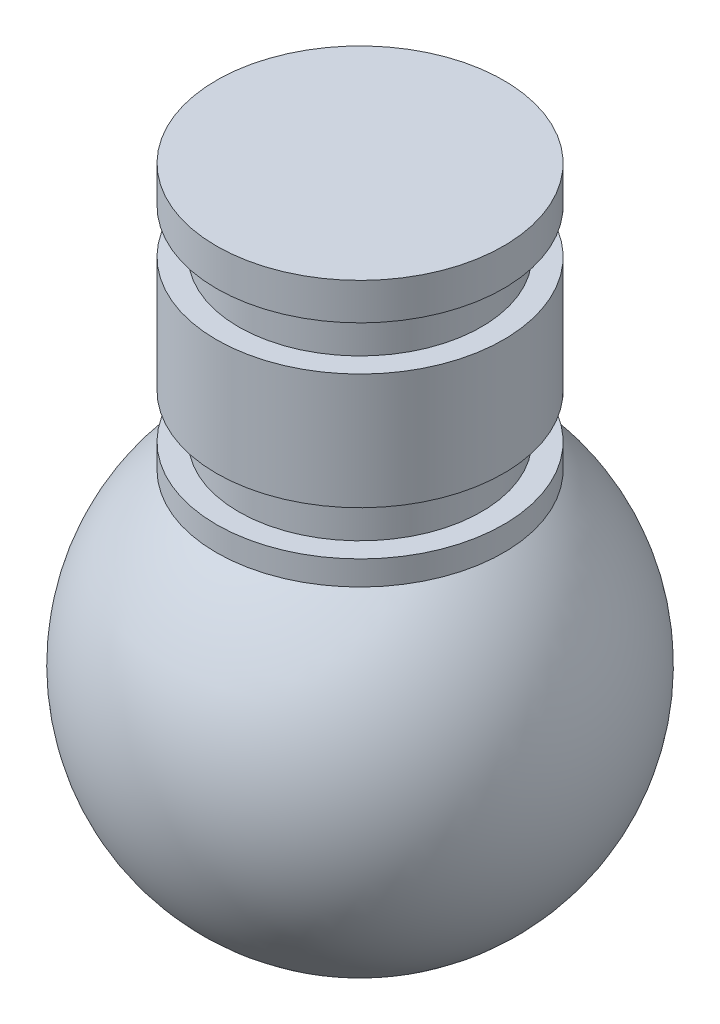
ISO-10303-21;
HEADER;
FILE_DESCRIPTION(('STEP AP214'),'2;1');
FILE_NAME('part.step','',(''),(''),'','','');
FILE_SCHEMA(('AUTOMOTIVE_DESIGN { 1 0 10303 214 1 1 1 1 }'));
ENDSEC;
DATA;
#1=APPLICATION_CONTEXT('core data for automotive mechanical design processes');
#2=APPLICATION_PROTOCOL_DEFINITION('international standard','automotive_design',2000,#1);
#3=PRODUCT_CONTEXT('',#1,'mechanical');
#4=PRODUCT('Part','Part','',(#3));
#5=PRODUCT_RELATED_PRODUCT_CATEGORY('part','',(#4));
#6=PRODUCT_DEFINITION_FORMATION('','',#4);
#7=PRODUCT_DEFINITION_CONTEXT('part definition',#1,'design');
#8=PRODUCT_DEFINITION('design','',#6,#7);
#9=PRODUCT_DEFINITION_SHAPE('','',#8);
#10=(LENGTH_UNIT() NAMED_UNIT(*) SI_UNIT(.MILLI.,.METRE.));
#11=(NAMED_UNIT(*) PLANE_ANGLE_UNIT() SI_UNIT($,.RADIAN.));
#12=(NAMED_UNIT(*) SI_UNIT($,.STERADIAN.) SOLID_ANGLE_UNIT());
#13=UNCERTAINTY_MEASURE_WITH_UNIT(LENGTH_MEASURE(1.E-05),#10,'distance_accuracy_value','');
#14=(GEOMETRIC_REPRESENTATION_CONTEXT(3) GLOBAL_UNCERTAINTY_ASSIGNED_CONTEXT((#13)) GLOBAL_UNIT_ASSIGNED_CONTEXT((#10,
#11,#12)) REPRESENTATION_CONTEXT('',''));
#15=CARTESIAN_POINT('',(0.,0.,0.));
#16=DIRECTION('',(0.,0.,1.));
#17=DIRECTION('',(1.,0.,0.));
#18=AXIS2_PLACEMENT_3D('',#15,#16,#17);
#19=CARTESIAN_POINT('',(6640.08458084277,3534.73119870931,0.));
#20=DIRECTION('',(0.,1.,0.));
#21=DIRECTION('',(-1.,0.,0.));
#22=AXIS2_PLACEMENT_3D('',#19,#20,#21);
#23=SPHERICAL_SURFACE('',#22,31.7500000000003);
#24=CARTESIAN_POINT('',(6640.08458084277,3558.91327934767,0.));
#25=DIRECTION('',(0.,1.,0.));
#26=DIRECTION('',(0.,0.,1.));
#27=AXIS2_PLACEMENT_3D('',#24,#25,#26);
#28=CIRCLE('',#27,20.5740000000008);
#29=CARTESIAN_POINT('',(6640.08458084277,3558.91327934767,20.5740000000008));
#30=VERTEX_POINT('',#29);
#31=EDGE_CURVE('E65',#30,#30,#28,.T.);
#32=ORIENTED_EDGE('',*,*,#31,.F.);
#33=EDGE_LOOP('',(#32));
#34=FACE_BOUND('',#33,.T.);
#35=ADVANCED_FACE('F31',(#34),#23,.T.);
#36=CARTESIAN_POINT('',(6640.08458084277,3596.96119870931,0.));
#37=DIRECTION('',(0.,1.,0.));
#38=DIRECTION('',(0.,0.,1.));
#39=AXIS2_PLACEMENT_3D('',#36,#37,#38);
#40=PLANE('',#39);
#41=CARTESIAN_POINT('',(6640.08458084277,3596.96119870931,0.));
#42=DIRECTION('',(0.,1.,0.));
#43=DIRECTION('',(0.,0.,1.));
#44=AXIS2_PLACEMENT_3D('',#41,#42,#43);
#45=CIRCLE('',#44,20.5740000000008);
#46=CARTESIAN_POINT('',(6640.08458084277,3596.96119870931,20.5740000000008));
#47=VERTEX_POINT('',#46);
#48=EDGE_CURVE('E10',#47,#47,#45,.T.);
#49=ORIENTED_EDGE('',*,*,#48,.T.);
#50=EDGE_LOOP('',(#49));
#51=FACE_BOUND('',#50,.T.);
#52=ADVANCED_FACE('F73',(#51),#40,.T.);
#53=CARTESIAN_POINT('',(6640.08458084277,3596.96119870931,0.));
#54=DIRECTION('',(0.,1.,0.));
#55=DIRECTION('',(0.,0.,1.));
#56=AXIS2_PLACEMENT_3D('',#53,#54,#55);
#57=CYLINDRICAL_SURFACE('',#56,20.5740000000008);
#58=CARTESIAN_POINT('',(6640.08458084277,3591.688770448,0.));
#59=DIRECTION('',(0.,1.,0.));
#60=DIRECTION('',(0.,0.,1.));
#61=AXIS2_PLACEMENT_3D('',#58,#59,#60);
#62=CIRCLE('',#61,20.5740000000008);
#63=CARTESIAN_POINT('',(6640.08458084277,3591.688770448,20.5740000000008));
#64=VERTEX_POINT('',#63);
#65=EDGE_CURVE('E37',#64,#64,#62,.T.);
#66=ORIENTED_EDGE('',*,*,#65,.T.);
#67=EDGE_LOOP('',(#66));
#68=FACE_BOUND('',#67,.T.);
#69=ORIENTED_EDGE('',*,*,#48,.F.);
#70=EDGE_LOOP('',(#69));
#71=FACE_BOUND('',#70,.T.);
#72=ADVANCED_FACE('F77',(#68,#71),#57,.T.);
#73=CARTESIAN_POINT('',(6622.68558084277,3591.688770448,0.));
#74=DIRECTION('',(0.,-1.,0.));
#75=DIRECTION('',(0.,0.,-1.));
#76=AXIS2_PLACEMENT_3D('',#73,#74,#75);
#77=PLANE('',#76);
#78=CARTESIAN_POINT('',(6640.08458084277,3591.688770448,0.));
#79=DIRECTION('',(0.,1.,0.));
#80=DIRECTION('',(0.,0.,1.));
#81=AXIS2_PLACEMENT_3D('',#78,#79,#80);
#82=CIRCLE('',#81,17.3990000000002);
#83=CARTESIAN_POINT('',(6640.08458084277,3591.688770448,17.3990000000002));
#84=VERTEX_POINT('',#83);
#85=EDGE_CURVE('E41',#84,#84,#82,.T.);
#86=ORIENTED_EDGE('',*,*,#85,.T.);
#87=EDGE_LOOP('',(#86));
#88=FACE_BOUND('',#87,.T.);
#89=ORIENTED_EDGE('',*,*,#65,.F.);
#90=EDGE_LOOP('',(#89));
#91=FACE_BOUND('',#90,.T.);
#92=ADVANCED_FACE('F81',(#88,#91),#77,.T.);
#93=CARTESIAN_POINT('',(6640.08458084277,3596.96119870931,0.));
#94=DIRECTION('',(0.,1.,0.));
#95=DIRECTION('',(0.,0.,1.));
#96=AXIS2_PLACEMENT_3D('',#93,#94,#95);
#97=CYLINDRICAL_SURFACE('',#96,17.3990000000002);
#98=CARTESIAN_POINT('',(6640.08458084277,3585.338770448,0.));
#99=DIRECTION('',(0.,1.,0.));
#100=DIRECTION('',(0.,0.,1.));
#101=AXIS2_PLACEMENT_3D('',#98,#99,#100);
#102=CIRCLE('',#101,17.3990000000002);
#103=CARTESIAN_POINT('',(6640.08458084277,3585.338770448,17.3990000000002));
#104=VERTEX_POINT('',#103);
#105=EDGE_CURVE('E45',#104,#104,#102,.T.);
#106=ORIENTED_EDGE('',*,*,#105,.T.);
#107=EDGE_LOOP('',(#106));
#108=FACE_BOUND('',#107,.T.);
#109=ORIENTED_EDGE('',*,*,#85,.F.);
#110=EDGE_LOOP('',(#109));
#111=FACE_BOUND('',#110,.T.);
#112=ADVANCED_FACE('F86',(#108,#111),#97,.T.);
#113=CARTESIAN_POINT('',(6622.68558084277,3585.338770448,0.));
#114=DIRECTION('',(0.,1.,0.));
#115=DIRECTION('',(0.,0.,1.));
#116=AXIS2_PLACEMENT_3D('',#113,#114,#115);
#117=PLANE('',#116);
#118=CARTESIAN_POINT('',(6640.08458084277,3585.338770448,0.));
#119=DIRECTION('',(0.,1.,0.));
#120=DIRECTION('',(0.,0.,1.));
#121=AXIS2_PLACEMENT_3D('',#118,#119,#120);
#122=CIRCLE('',#121,20.5740000000008);
#123=CARTESIAN_POINT('',(6640.08458084277,3585.338770448,20.5740000000008));
#124=VERTEX_POINT('',#123);
#125=EDGE_CURVE('E50',#124,#124,#122,.T.);
#126=ORIENTED_EDGE('',*,*,#125,.T.);
#127=EDGE_LOOP('',(#126));
#128=FACE_BOUND('',#127,.T.);
#129=ORIENTED_EDGE('',*,*,#105,.F.);
#130=EDGE_LOOP('',(#129));
#131=FACE_BOUND('',#130,.T.);
#132=ADVANCED_FACE('F90',(#128,#131),#117,.T.);
#133=CARTESIAN_POINT('',(6640.08458084277,3596.96119870931,0.));
#134=DIRECTION('',(0.,1.,0.));
#135=DIRECTION('',(0.,0.,1.));
#136=AXIS2_PLACEMENT_3D('',#133,#134,#135);
#137=CYLINDRICAL_SURFACE('',#136,20.5740000000012);
#138=CARTESIAN_POINT('',(6640.08458084277,3568.75014271533,0.));
#139=DIRECTION('',(0.,1.,0.));
#140=DIRECTION('',(0.,0.,1.));
#141=AXIS2_PLACEMENT_3D('',#138,#139,#140);
#142=CIRCLE('',#141,20.5740000000016);
#143=CARTESIAN_POINT('',(6640.08458084277,3568.75014271533,20.5740000000016));
#144=VERTEX_POINT('',#143);
#145=EDGE_CURVE('E53',#144,#144,#142,.T.);
#146=ORIENTED_EDGE('',*,*,#145,.T.);
#147=EDGE_LOOP('',(#146));
#148=FACE_BOUND('',#147,.T.);
#149=ORIENTED_EDGE('',*,*,#125,.F.);
#150=EDGE_LOOP('',(#149));
#151=FACE_BOUND('',#150,.T.);
#152=ADVANCED_FACE('F94',(#148,#151),#137,.T.);
#153=CARTESIAN_POINT('',(6619.51058084277,3568.75014271534,0.));
#154=DIRECTION('',(0.,-1.,0.));
#155=DIRECTION('',(0.,0.,-1.));
#156=AXIS2_PLACEMENT_3D('',#153,#154,#155);
#157=PLANE('',#156);
#158=CARTESIAN_POINT('',(6640.08458084277,3568.75014271534,0.));
#159=DIRECTION('',(0.,1.,0.));
#160=DIRECTION('',(0.,0.,1.));
#161=AXIS2_PLACEMENT_3D('',#158,#159,#160);
#162=CIRCLE('',#161,17.3989999999993);
#163=CARTESIAN_POINT('',(6640.08458084277,3568.75014271534,17.3989999999993));
#164=VERTEX_POINT('',#163);
#165=EDGE_CURVE('E56',#164,#164,#162,.T.);
#166=ORIENTED_EDGE('',*,*,#165,.T.);
#167=EDGE_LOOP('',(#166));
#168=FACE_BOUND('',#167,.T.);
#169=ORIENTED_EDGE('',*,*,#145,.F.);
#170=EDGE_LOOP('',(#169));
#171=FACE_BOUND('',#170,.T.);
#172=ADVANCED_FACE('F98',(#168,#171),#157,.T.);
#173=CARTESIAN_POINT('',(6640.08458084277,3596.96119870931,0.));
#174=DIRECTION('',(0.,1.,0.));
#175=DIRECTION('',(0.,0.,1.));
#176=AXIS2_PLACEMENT_3D('',#173,#174,#175);
#177=CYLINDRICAL_SURFACE('',#176,17.3990000000006);
#178=CARTESIAN_POINT('',(6640.08458084277,3562.40014271533,0.));
#179=DIRECTION('',(0.,1.,0.));
#180=DIRECTION('',(0.,0.,1.));
#181=AXIS2_PLACEMENT_3D('',#178,#179,#180);
#182=CIRCLE('',#181,17.3990000000019);
#183=CARTESIAN_POINT('',(6640.08458084277,3562.40014271533,17.3990000000019));
#184=VERTEX_POINT('',#183);
#185=EDGE_CURVE('E59',#184,#184,#182,.T.);
#186=ORIENTED_EDGE('',*,*,#185,.T.);
#187=EDGE_LOOP('',(#186));
#188=FACE_BOUND('',#187,.T.);
#189=ORIENTED_EDGE('',*,*,#165,.F.);
#190=EDGE_LOOP('',(#189));
#191=FACE_BOUND('',#190,.T.);
#192=ADVANCED_FACE('F102',(#188,#191),#177,.T.);
#193=CARTESIAN_POINT('',(6619.51058084277,3562.40014271533,0.));
#194=DIRECTION('',(0.,1.,0.));
#195=DIRECTION('',(0.,0.,1.));
#196=AXIS2_PLACEMENT_3D('',#193,#194,#195);
#197=PLANE('',#196);
#198=CARTESIAN_POINT('',(6640.08458084277,3562.40014271533,0.));
#199=DIRECTION('',(0.,1.,0.));
#200=DIRECTION('',(0.,0.,1.));
#201=AXIS2_PLACEMENT_3D('',#198,#199,#200);
#202=CIRCLE('',#201,20.5740000000016);
#203=CARTESIAN_POINT('',(6640.08458084277,3562.40014271533,20.5740000000016));
#204=VERTEX_POINT('',#203);
#205=EDGE_CURVE('E62',#204,#204,#202,.T.);
#206=ORIENTED_EDGE('',*,*,#205,.T.);
#207=EDGE_LOOP('',(#206));
#208=FACE_BOUND('',#207,.T.);
#209=ORIENTED_EDGE('',*,*,#185,.F.);
#210=EDGE_LOOP('',(#209));
#211=FACE_BOUND('',#210,.T.);
#212=ADVANCED_FACE('F106',(#208,#211),#197,.T.);
#213=CARTESIAN_POINT('',(6640.08458084277,3596.96119870931,0.));
#214=DIRECTION('',(0.,1.,0.));
#215=DIRECTION('',(0.,0.,1.));
#216=AXIS2_PLACEMENT_3D('',#213,#214,#215);
#217=CYLINDRICAL_SURFACE('',#216,20.5740000000012);
#218=ORIENTED_EDGE('',*,*,#31,.T.);
#219=EDGE_LOOP('',(#218));
#220=FACE_BOUND('',#219,.T.);
#221=ORIENTED_EDGE('',*,*,#205,.F.);
#222=EDGE_LOOP('',(#221));
#223=FACE_BOUND('',#222,.T.);
#224=ADVANCED_FACE('F69',(#220,#223),#217,.T.);
#225=CLOSED_SHELL('',(#35,#52,#72,#92,#112,#132,#152,#172,#192,#212,#224));
#226=MANIFOLD_SOLID_BREP('B2',#225);
#227=ADVANCED_BREP_SHAPE_REPRESENTATION('',(#18,#226),#14);
#228=SHAPE_DEFINITION_REPRESENTATION(#9,#227);
ENDSEC;
END-ISO-10303-21;
